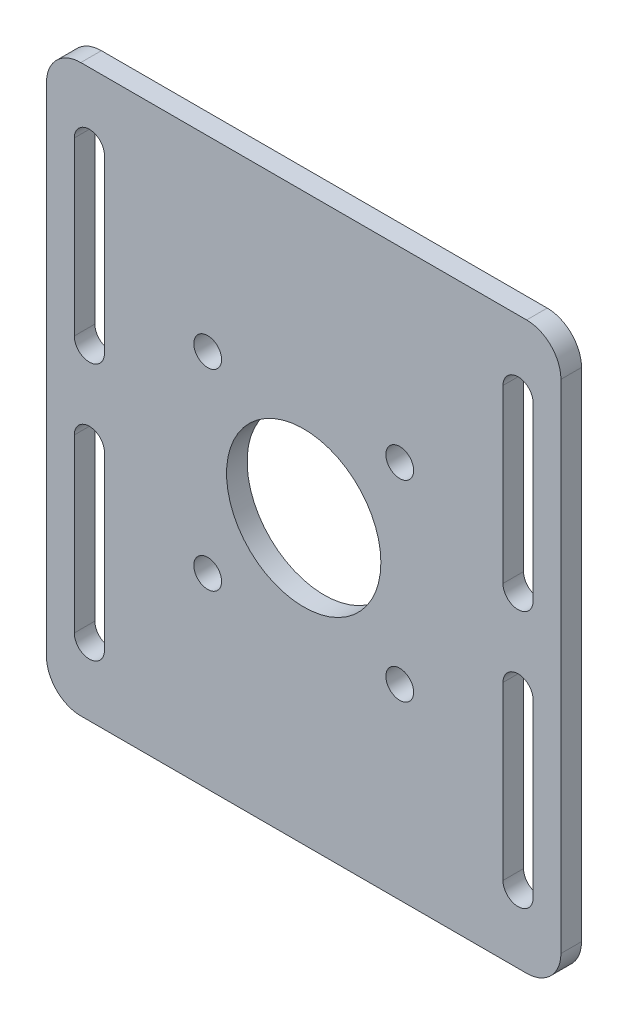
ISO-10303-21;
HEADER;
FILE_DESCRIPTION(('STEP AP214'),'2;1');
FILE_NAME('part.step','',(''),(''),'','','');
FILE_SCHEMA(('AUTOMOTIVE_DESIGN { 1 0 10303 214 1 1 1 1 }'));
ENDSEC;
DATA;
#1=APPLICATION_CONTEXT('core data for automotive mechanical design processes');
#2=APPLICATION_PROTOCOL_DEFINITION('international standard','automotive_design',2000,#1);
#3=PRODUCT_CONTEXT('',#1,'mechanical');
#4=PRODUCT('Part','Part','',(#3));
#5=PRODUCT_RELATED_PRODUCT_CATEGORY('part','',(#4));
#6=PRODUCT_DEFINITION_FORMATION('','',#4);
#7=PRODUCT_DEFINITION_CONTEXT('part definition',#1,'design');
#8=PRODUCT_DEFINITION('design','',#6,#7);
#9=PRODUCT_DEFINITION_SHAPE('','',#8);
#10=(LENGTH_UNIT() NAMED_UNIT(*) SI_UNIT(.MILLI.,.METRE.));
#11=(NAMED_UNIT(*) PLANE_ANGLE_UNIT() SI_UNIT($,.RADIAN.));
#12=(NAMED_UNIT(*) SI_UNIT($,.STERADIAN.) SOLID_ANGLE_UNIT());
#13=UNCERTAINTY_MEASURE_WITH_UNIT(LENGTH_MEASURE(1.E-05),#10,'distance_accuracy_value','');
#14=(GEOMETRIC_REPRESENTATION_CONTEXT(3) GLOBAL_UNCERTAINTY_ASSIGNED_CONTEXT((#13)) GLOBAL_UNIT_ASSIGNED_CONTEXT((#10,
#11,#12)) REPRESENTATION_CONTEXT('',''));
#15=CARTESIAN_POINT('',(0.,0.,0.));
#16=DIRECTION('',(0.,0.,1.));
#17=DIRECTION('',(1.,0.,0.));
#18=AXIS2_PLACEMENT_3D('',#15,#16,#17);
#19=CARTESIAN_POINT('',(0.,0.,6.));
#20=DIRECTION('',(0.,0.,-1.));
#21=DIRECTION('',(-1.,0.,0.));
#22=AXIS2_PLACEMENT_3D('',#19,#20,#21);
#23=PLANE('',#22);
#24=DIRECTION('',(0.,1.,0.));
#25=VECTOR('',#24,1.);
#26=CARTESIAN_POINT('',(-116.2,25.,6.00000000000001));
#27=LINE('',#26,#25);
#28=CARTESIAN_POINT('',(-116.2,25.,6.00000000000001));
#29=VERTEX_POINT('',#28);
#30=CARTESIAN_POINT('',(-116.2,125.,6.00000000000001));
#31=VERTEX_POINT('',#30);
#32=EDGE_CURVE('E295',#29,#31,#27,.T.);
#33=ORIENTED_EDGE('',*,*,#32,.F.);
#34=CARTESIAN_POINT('',(-125.,25.,6.00000000000001));
#35=DIRECTION('',(0.,0.,-1.));
#36=DIRECTION('',(-1.,0.,0.));
#37=AXIS2_PLACEMENT_3D('',#34,#35,#36);
#38=CIRCLE('',#37,8.79999999999995);
#39=CARTESIAN_POINT('',(-133.8,25.,6.00000000000001));
#40=VERTEX_POINT('',#39);
#41=EDGE_CURVE('E299',#40,#29,#38,.F.);
#42=ORIENTED_EDGE('',*,*,#41,.F.);
#43=DIRECTION('',(0.,-1.,0.));
#44=VECTOR('',#43,1.);
#45=CARTESIAN_POINT('',(-133.8,25.,6.00000000000001));
#46=LINE('',#45,#44);
#47=CARTESIAN_POINT('',(-133.8,125.,6.));
#48=VERTEX_POINT('',#47);
#49=EDGE_CURVE('E268',#48,#40,#46,.T.);
#50=ORIENTED_EDGE('',*,*,#49,.F.);
#51=CARTESIAN_POINT('',(-125.,125.,6.00000000000001));
#52=DIRECTION('',(0.,0.,-1.));
#53=DIRECTION('',(-1.,0.,0.));
#54=AXIS2_PLACEMENT_3D('',#51,#52,#53);
#55=CIRCLE('',#54,8.79999999999994);
#56=EDGE_CURVE('E292',#31,#48,#55,.F.);
#57=ORIENTED_EDGE('',*,*,#56,.F.);
#58=EDGE_LOOP('',(#33,#42,#50,#57));
#59=FACE_BOUND('',#58,.T.);
#60=DIRECTION('',(0.,-1.,0.));
#61=VECTOR('',#60,1.);
#62=CARTESIAN_POINT('',(-133.8,-25.,6.00000000000001));
#63=LINE('',#62,#61);
#64=CARTESIAN_POINT('',(-133.8,-25.,6.00000000000001));
#65=VERTEX_POINT('',#64);
#66=CARTESIAN_POINT('',(-133.8,-125.,6.00000000000001));
#67=VERTEX_POINT('',#66);
#68=EDGE_CURVE('E256',#65,#67,#63,.T.);
#69=ORIENTED_EDGE('',*,*,#68,.F.);
#70=CARTESIAN_POINT('',(-125.,-25.,6.00000000000001));
#71=DIRECTION('',(0.,0.,-1.));
#72=DIRECTION('',(-1.,0.,0.));
#73=AXIS2_PLACEMENT_3D('',#70,#71,#72);
#74=CIRCLE('',#73,8.79999999999995);
#75=CARTESIAN_POINT('',(-116.2,-25.,6.00000000000001));
#76=VERTEX_POINT('',#75);
#77=EDGE_CURVE('E260',#76,#65,#74,.F.);
#78=ORIENTED_EDGE('',*,*,#77,.F.);
#79=DIRECTION('',(0.,1.,0.));
#80=VECTOR('',#79,1.);
#81=CARTESIAN_POINT('',(-116.2,-25.,6.00000000000001));
#82=LINE('',#81,#80);
#83=CARTESIAN_POINT('',(-116.2,-125.,6.));
#84=VERTEX_POINT('',#83);
#85=EDGE_CURVE('E263',#84,#76,#82,.T.);
#86=ORIENTED_EDGE('',*,*,#85,.F.);
#87=CARTESIAN_POINT('',(-125.,-125.,6.00000000000001));
#88=DIRECTION('',(0.,0.,-1.));
#89=DIRECTION('',(-1.,0.,0.));
#90=AXIS2_PLACEMENT_3D('',#87,#88,#89);
#91=CIRCLE('',#90,8.79999999999994);
#92=EDGE_CURVE('E253',#67,#84,#91,.F.);
#93=ORIENTED_EDGE('',*,*,#92,.F.);
#94=EDGE_LOOP('',(#69,#78,#86,#93));
#95=FACE_BOUND('',#94,.T.);
#96=DIRECTION('',(0.,-1.,0.));
#97=VECTOR('',#96,1.);
#98=CARTESIAN_POINT('',(116.2,-24.9999999999999,6.00000000000001));
#99=LINE('',#98,#97);
#100=CARTESIAN_POINT('',(116.2,-24.9999999999999,6.00000000000001));
#101=VERTEX_POINT('',#100);
#102=CARTESIAN_POINT('',(116.2,-125.,6.00000000000001));
#103=VERTEX_POINT('',#102);
#104=EDGE_CURVE('E835',#101,#103,#99,.T.);
#105=ORIENTED_EDGE('',*,*,#104,.F.);
#106=CARTESIAN_POINT('',(125.,-25.,6.00000000000001));
#107=DIRECTION('',(0.,0.,-1.));
#108=DIRECTION('',(-1.,0.,0.));
#109=AXIS2_PLACEMENT_3D('',#106,#107,#108);
#110=CIRCLE('',#109,8.79999999999996);
#111=CARTESIAN_POINT('',(133.8,-25.,6.00000000000001));
#112=VERTEX_POINT('',#111);
#113=EDGE_CURVE('E252',#112,#101,#110,.F.);
#114=ORIENTED_EDGE('',*,*,#113,.F.);
#115=DIRECTION('',(0.,1.,0.));
#116=VECTOR('',#115,1.);
#117=CARTESIAN_POINT('',(133.8,-25.,6.00000000000001));
#118=LINE('',#117,#116);
#119=CARTESIAN_POINT('',(133.8,-125.,6.));
#120=VERTEX_POINT('',#119);
#121=EDGE_CURVE('E248',#120,#112,#118,.T.);
#122=ORIENTED_EDGE('',*,*,#121,.F.);
#123=CARTESIAN_POINT('',(125.,-125.,6.00000000000001));
#124=DIRECTION('',(0.,0.,-1.));
#125=DIRECTION('',(-1.,0.,0.));
#126=AXIS2_PLACEMENT_3D('',#123,#124,#125);
#127=CIRCLE('',#126,8.79999999999997);
#128=EDGE_CURVE('E213',#103,#120,#127,.F.);
#129=ORIENTED_EDGE('',*,*,#128,.F.);
#130=EDGE_LOOP('',(#105,#114,#122,#129));
#131=FACE_BOUND('',#130,.T.);
#132=DIRECTION('',(0.,1.,0.));
#133=VECTOR('',#132,1.);
#134=CARTESIAN_POINT('',(133.8,25.,6.00000000000001));
#135=LINE('',#134,#133);
#136=CARTESIAN_POINT('',(133.8,25.,6.00000000000001));
#137=VERTEX_POINT('',#136);
#138=CARTESIAN_POINT('',(133.8,125.,6.00000000000001));
#139=VERTEX_POINT('',#138);
#140=EDGE_CURVE('E333',#137,#139,#135,.T.);
#141=ORIENTED_EDGE('',*,*,#140,.F.);
#142=CARTESIAN_POINT('',(125.,25.,6.00000000000001));
#143=DIRECTION('',(0.,0.,-1.));
#144=DIRECTION('',(-1.,0.,0.));
#145=AXIS2_PLACEMENT_3D('',#142,#143,#144);
#146=CIRCLE('',#145,8.79999999999996);
#147=CARTESIAN_POINT('',(116.2,24.9999999999999,6.00000000000001));
#148=VERTEX_POINT('',#147);
#149=EDGE_CURVE('E337',#148,#137,#146,.F.);
#150=ORIENTED_EDGE('',*,*,#149,.F.);
#151=DIRECTION('',(0.,-1.,0.));
#152=VECTOR('',#151,1.);
#153=CARTESIAN_POINT('',(116.2,24.9999999999999,6.00000000000001));
#154=LINE('',#153,#152);
#155=CARTESIAN_POINT('',(116.2,125.,6.));
#156=VERTEX_POINT('',#155);
#157=EDGE_CURVE('E340',#156,#148,#154,.T.);
#158=ORIENTED_EDGE('',*,*,#157,.F.);
#159=CARTESIAN_POINT('',(125.,125.,6.00000000000001));
#160=DIRECTION('',(0.,0.,-1.));
#161=DIRECTION('',(-1.,0.,0.));
#162=AXIS2_PLACEMENT_3D('',#159,#160,#161);
#163=CIRCLE('',#162,8.79999999999997);
#164=EDGE_CURVE('E329',#139,#156,#163,.F.);
#165=ORIENTED_EDGE('',*,*,#164,.F.);
#166=EDGE_LOOP('',(#141,#150,#158,#165));
#167=FACE_BOUND('',#166,.T.);
#168=CARTESIAN_POINT('',(-56.,-56.,6.));
#169=DIRECTION('',(0.,0.,1.));
#170=DIRECTION('',(1.,0.,0.));
#171=AXIS2_PLACEMENT_3D('',#168,#169,#170);
#172=CIRCLE('',#171,8.1);
#173=CARTESIAN_POINT('',(-47.9,-56.,6.));
#174=VERTEX_POINT('',#173);
#175=EDGE_CURVE('E369',#174,#174,#172,.T.);
#176=ORIENTED_EDGE('',*,*,#175,.F.);
#177=EDGE_LOOP('',(#176));
#178=FACE_BOUND('',#177,.T.);
#179=CARTESIAN_POINT('',(56.,-56.,6.));
#180=DIRECTION('',(0.,0.,1.));
#181=DIRECTION('',(1.,0.,0.));
#182=AXIS2_PLACEMENT_3D('',#179,#180,#181);
#183=CIRCLE('',#182,8.09999999999999);
#184=CARTESIAN_POINT('',(64.1,-56.,6.));
#185=VERTEX_POINT('',#184);
#186=EDGE_CURVE('E380',#185,#185,#183,.T.);
#187=ORIENTED_EDGE('',*,*,#186,.F.);
#188=EDGE_LOOP('',(#187));
#189=FACE_BOUND('',#188,.T.);
#190=CARTESIAN_POINT('',(56.,56.,6.));
#191=DIRECTION('',(0.,0.,1.));
#192=DIRECTION('',(1.,0.,0.));
#193=AXIS2_PLACEMENT_3D('',#190,#191,#192);
#194=CIRCLE('',#193,8.09999999999999);
#195=CARTESIAN_POINT('',(64.1,56.,6.));
#196=VERTEX_POINT('',#195);
#197=EDGE_CURVE('E370',#196,#196,#194,.T.);
#198=ORIENTED_EDGE('',*,*,#197,.F.);
#199=EDGE_LOOP('',(#198));
#200=FACE_BOUND('',#199,.T.);
#201=CARTESIAN_POINT('',(-56.,56.,6.));
#202=DIRECTION('',(0.,0.,1.));
#203=DIRECTION('',(1.,0.,0.));
#204=AXIS2_PLACEMENT_3D('',#201,#202,#203);
#205=CIRCLE('',#204,8.1);
#206=CARTESIAN_POINT('',(-47.9,56.,6.));
#207=VERTEX_POINT('',#206);
#208=EDGE_CURVE('E379',#207,#207,#205,.T.);
#209=ORIENTED_EDGE('',*,*,#208,.F.);
#210=EDGE_LOOP('',(#209));
#211=FACE_BOUND('',#210,.T.);
#212=DIRECTION('',(1.,0.,0.));
#213=VECTOR('',#212,1.);
#214=CARTESIAN_POINT('',(-150.,-165.,6.));
#215=LINE('',#214,#213);
#216=CARTESIAN_POINT('',(-130.,-165.,6.));
#217=VERTEX_POINT('',#216);
#218=CARTESIAN_POINT('',(130.,-165.,6.));
#219=VERTEX_POINT('',#218);
#220=EDGE_CURVE('E423',#217,#219,#215,.T.);
#221=ORIENTED_EDGE('',*,*,#220,.T.);
#222=CARTESIAN_POINT('',(130.,-145.,6.));
#223=DIRECTION('',(0.,0.,-1.));
#224=DIRECTION('',(-1.,0.,0.));
#225=AXIS2_PLACEMENT_3D('',#222,#223,#224);
#226=CIRCLE('',#225,20.);
#227=CARTESIAN_POINT('',(150.,-145.,6.));
#228=VERTEX_POINT('',#227);
#229=EDGE_CURVE('E476',#219,#228,#226,.F.);
#230=ORIENTED_EDGE('',*,*,#229,.T.);
#231=DIRECTION('',(0.,1.,0.));
#232=VECTOR('',#231,1.);
#233=CARTESIAN_POINT('',(150.,-165.,6.));
#234=LINE('',#233,#232);
#235=CARTESIAN_POINT('',(150.,145.,6.));
#236=VERTEX_POINT('',#235);
#237=EDGE_CURVE('E410',#228,#236,#234,.T.);
#238=ORIENTED_EDGE('',*,*,#237,.T.);
#239=CARTESIAN_POINT('',(130.,145.,6.));
#240=DIRECTION('',(0.,0.,-1.));
#241=DIRECTION('',(-1.,0.,0.));
#242=AXIS2_PLACEMENT_3D('',#239,#240,#241);
#243=CIRCLE('',#242,20.);
#244=CARTESIAN_POINT('',(130.,165.,6.));
#245=VERTEX_POINT('',#244);
#246=EDGE_CURVE('E470',#236,#245,#243,.F.);
#247=ORIENTED_EDGE('',*,*,#246,.T.);
#248=DIRECTION('',(-1.,0.,0.));
#249=VECTOR('',#248,1.);
#250=CARTESIAN_POINT('',(-150.,165.,6.));
#251=LINE('',#250,#249);
#252=CARTESIAN_POINT('',(-130.,165.,6.));
#253=VERTEX_POINT('',#252);
#254=EDGE_CURVE('E414',#245,#253,#251,.T.);
#255=ORIENTED_EDGE('',*,*,#254,.T.);
#256=CARTESIAN_POINT('',(-130.,145.,6.));
#257=DIRECTION('',(0.,0.,-1.));
#258=DIRECTION('',(-1.,0.,0.));
#259=AXIS2_PLACEMENT_3D('',#256,#257,#258);
#260=CIRCLE('',#259,20.);
#261=CARTESIAN_POINT('',(-150.,145.,6.));
#262=VERTEX_POINT('',#261);
#263=EDGE_CURVE('E467',#253,#262,#260,.F.);
#264=ORIENTED_EDGE('',*,*,#263,.T.);
#265=DIRECTION('',(0.,-1.,0.));
#266=VECTOR('',#265,1.);
#267=CARTESIAN_POINT('',(-150.,-165.,6.));
#268=LINE('',#267,#266);
#269=CARTESIAN_POINT('',(-150.,-145.,6.));
#270=VERTEX_POINT('',#269);
#271=EDGE_CURVE('E419',#262,#270,#268,.T.);
#272=ORIENTED_EDGE('',*,*,#271,.T.);
#273=CARTESIAN_POINT('',(-130.,-145.,6.));
#274=DIRECTION('',(0.,0.,-1.));
#275=DIRECTION('',(-1.,0.,0.));
#276=AXIS2_PLACEMENT_3D('',#273,#274,#275);
#277=CIRCLE('',#276,20.);
#278=EDGE_CURVE('E473',#270,#217,#277,.F.);
#279=ORIENTED_EDGE('',*,*,#278,.T.);
#280=EDGE_LOOP('',(#221,#230,#238,#247,#255,#264,#272,#279));
#281=FACE_BOUND('',#280,.T.);
#282=CARTESIAN_POINT('',(0.,0.,6.));
#283=DIRECTION('',(0.,0.,1.));
#284=DIRECTION('',(1.,0.,0.));
#285=AXIS2_PLACEMENT_3D('',#282,#283,#284);
#286=CIRCLE('',#285,45.);
#287=CARTESIAN_POINT('',(45.,0.,6.));
#288=VERTEX_POINT('',#287);
#289=EDGE_CURVE('E402',#288,#288,#286,.T.);
#290=ORIENTED_EDGE('',*,*,#289,.F.);
#291=EDGE_LOOP('',(#290));
#292=FACE_BOUND('',#291,.T.);
#293=ADVANCED_FACE('F43',(#59,#95,#131,#167,#178,#189,#200,#211,#281,#292),#23,.F.);
#294=CARTESIAN_POINT('',(0.,0.,-6.));
#295=DIRECTION('',(0.,0.,-1.));
#296=DIRECTION('',(-1.,0.,0.));
#297=AXIS2_PLACEMENT_3D('',#294,#295,#296);
#298=PLANE('',#297);
#299=CARTESIAN_POINT('',(-125.,25.,-6.));
#300=DIRECTION('',(0.,0.,-1.));
#301=DIRECTION('',(1.,0.,0.));
#302=AXIS2_PLACEMENT_3D('',#299,#300,#301);
#303=CIRCLE('',#302,8.79999999999995);
#304=CARTESIAN_POINT('',(-116.2,25.,-6.));
#305=VERTEX_POINT('',#304);
#306=CARTESIAN_POINT('',(-133.8,25.,-6.));
#307=VERTEX_POINT('',#306);
#308=EDGE_CURVE('E302',#305,#307,#303,.T.);
#309=ORIENTED_EDGE('',*,*,#308,.F.);
#310=DIRECTION('',(0.,-1.,0.));
#311=VECTOR('',#310,1.);
#312=CARTESIAN_POINT('',(-116.2,25.,-6.));
#313=LINE('',#312,#311);
#314=CARTESIAN_POINT('',(-116.2,125.,-6.));
#315=VERTEX_POINT('',#314);
#316=EDGE_CURVE('E312',#315,#305,#313,.T.);
#317=ORIENTED_EDGE('',*,*,#316,.F.);
#318=CARTESIAN_POINT('',(-125.,125.,-6.));
#319=DIRECTION('',(0.,0.,-1.));
#320=DIRECTION('',(1.,0.,0.));
#321=AXIS2_PLACEMENT_3D('',#318,#319,#320);
#322=CIRCLE('',#321,8.79999999999994);
#323=CARTESIAN_POINT('',(-133.8,125.,-6.));
#324=VERTEX_POINT('',#323);
#325=EDGE_CURVE('E308',#324,#315,#322,.T.);
#326=ORIENTED_EDGE('',*,*,#325,.F.);
#327=DIRECTION('',(0.,1.,0.));
#328=VECTOR('',#327,1.);
#329=CARTESIAN_POINT('',(-133.8,25.,-6.));
#330=LINE('',#329,#328);
#331=EDGE_CURVE('E305',#307,#324,#330,.T.);
#332=ORIENTED_EDGE('',*,*,#331,.F.);
#333=EDGE_LOOP('',(#309,#317,#326,#332));
#334=FACE_BOUND('',#333,.T.);
#335=CARTESIAN_POINT('',(-125.,-25.,-6.));
#336=DIRECTION('',(0.,0.,-1.));
#337=DIRECTION('',(-1.,0.,0.));
#338=AXIS2_PLACEMENT_3D('',#335,#336,#337);
#339=CIRCLE('',#338,8.79999999999995);
#340=CARTESIAN_POINT('',(-133.8,-25.,-6.));
#341=VERTEX_POINT('',#340);
#342=CARTESIAN_POINT('',(-116.2,-25.,-6.));
#343=VERTEX_POINT('',#342);
#344=EDGE_CURVE('E264',#341,#343,#339,.T.);
#345=ORIENTED_EDGE('',*,*,#344,.F.);
#346=DIRECTION('',(0.,1.,0.));
#347=VECTOR('',#346,1.);
#348=CARTESIAN_POINT('',(-133.8,-25.,-6.));
#349=LINE('',#348,#347);
#350=CARTESIAN_POINT('',(-133.8,-125.,-6.));
#351=VERTEX_POINT('',#350);
#352=EDGE_CURVE('E275',#351,#341,#349,.T.);
#353=ORIENTED_EDGE('',*,*,#352,.F.);
#354=CARTESIAN_POINT('',(-125.,-125.,-6.));
#355=DIRECTION('',(0.,0.,-1.));
#356=DIRECTION('',(-1.,0.,0.));
#357=AXIS2_PLACEMENT_3D('',#354,#355,#356);
#358=CIRCLE('',#357,8.79999999999994);
#359=CARTESIAN_POINT('',(-116.2,-125.,-6.));
#360=VERTEX_POINT('',#359);
#361=EDGE_CURVE('E271',#360,#351,#358,.T.);
#362=ORIENTED_EDGE('',*,*,#361,.F.);
#363=DIRECTION('',(0.,-1.,0.));
#364=VECTOR('',#363,1.);
#365=CARTESIAN_POINT('',(-116.2,-25.,-6.));
#366=LINE('',#365,#364);
#367=EDGE_CURVE('E267',#343,#360,#366,.T.);
#368=ORIENTED_EDGE('',*,*,#367,.F.);
#369=EDGE_LOOP('',(#345,#353,#362,#368));
#370=FACE_BOUND('',#369,.T.);
#371=CARTESIAN_POINT('',(125.,-25.,-6.));
#372=DIRECTION('',(0.,0.,-1.));
#373=DIRECTION('',(1.,0.,0.));
#374=AXIS2_PLACEMENT_3D('',#371,#372,#373);
#375=CIRCLE('',#374,8.79999999999996);
#376=CARTESIAN_POINT('',(116.2,-24.9999999999999,-6.));
#377=VERTEX_POINT('',#376);
#378=CARTESIAN_POINT('',(133.8,-25.,-6.));
#379=VERTEX_POINT('',#378);
#380=EDGE_CURVE('E228',#377,#379,#375,.T.);
#381=ORIENTED_EDGE('',*,*,#380,.F.);
#382=DIRECTION('',(0.,1.,0.));
#383=VECTOR('',#382,1.);
#384=CARTESIAN_POINT('',(116.2,-24.9999999999999,-6.));
#385=LINE('',#384,#383);
#386=CARTESIAN_POINT('',(116.2,-125.,-6.));
#387=VERTEX_POINT('',#386);
#388=EDGE_CURVE('E233',#387,#377,#385,.T.);
#389=ORIENTED_EDGE('',*,*,#388,.F.);
#390=CARTESIAN_POINT('',(125.,-125.,-6.));
#391=DIRECTION('',(0.,0.,-1.));
#392=DIRECTION('',(1.,0.,0.));
#393=AXIS2_PLACEMENT_3D('',#390,#391,#392);
#394=CIRCLE('',#393,8.79999999999997);
#395=CARTESIAN_POINT('',(133.8,-125.,-6.));
#396=VERTEX_POINT('',#395);
#397=EDGE_CURVE('E210',#396,#387,#394,.T.);
#398=ORIENTED_EDGE('',*,*,#397,.F.);
#399=DIRECTION('',(0.,-1.,0.));
#400=VECTOR('',#399,1.);
#401=CARTESIAN_POINT('',(133.8,-25.,-6.));
#402=LINE('',#401,#400);
#403=EDGE_CURVE('E222',#379,#396,#402,.T.);
#404=ORIENTED_EDGE('',*,*,#403,.F.);
#405=EDGE_LOOP('',(#381,#389,#398,#404));
#406=FACE_BOUND('',#405,.T.);
#407=CARTESIAN_POINT('',(125.,25.,-6.));
#408=DIRECTION('',(0.,0.,-1.));
#409=DIRECTION('',(-1.,0.,0.));
#410=AXIS2_PLACEMENT_3D('',#407,#408,#409);
#411=CIRCLE('',#410,8.79999999999996);
#412=CARTESIAN_POINT('',(133.8,25.,-6.));
#413=VERTEX_POINT('',#412);
#414=CARTESIAN_POINT('',(116.2,24.9999999999999,-6.));
#415=VERTEX_POINT('',#414);
#416=EDGE_CURVE('E251',#413,#415,#411,.T.);
#417=ORIENTED_EDGE('',*,*,#416,.F.);
#418=DIRECTION('',(0.,-1.,0.));
#419=VECTOR('',#418,1.);
#420=CARTESIAN_POINT('',(133.8,25.,-6.));
#421=LINE('',#420,#419);
#422=CARTESIAN_POINT('',(133.8,125.,-6.));
#423=VERTEX_POINT('',#422);
#424=EDGE_CURVE('E351',#423,#413,#421,.T.);
#425=ORIENTED_EDGE('',*,*,#424,.F.);
#426=CARTESIAN_POINT('',(125.,125.,-6.));
#427=DIRECTION('',(0.,0.,-1.));
#428=DIRECTION('',(-1.,0.,0.));
#429=AXIS2_PLACEMENT_3D('',#426,#427,#428);
#430=CIRCLE('',#429,8.79999999999997);
#431=CARTESIAN_POINT('',(116.2,125.,-6.));
#432=VERTEX_POINT('',#431);
#433=EDGE_CURVE('E347',#432,#423,#430,.T.);
#434=ORIENTED_EDGE('',*,*,#433,.F.);
#435=DIRECTION('',(0.,1.,0.));
#436=VECTOR('',#435,1.);
#437=CARTESIAN_POINT('',(116.2,24.9999999999999,-6.));
#438=LINE('',#437,#436);
#439=EDGE_CURVE('E343',#415,#432,#438,.T.);
#440=ORIENTED_EDGE('',*,*,#439,.F.);
#441=EDGE_LOOP('',(#417,#425,#434,#440));
#442=FACE_BOUND('',#441,.T.);
#443=CARTESIAN_POINT('',(-56.,-56.,-6.));
#444=DIRECTION('',(0.,0.,-1.));
#445=DIRECTION('',(-1.,0.,0.));
#446=AXIS2_PLACEMENT_3D('',#443,#444,#445);
#447=CIRCLE('',#446,8.1);
#448=CARTESIAN_POINT('',(-64.1,-56.,-6.));
#449=VERTEX_POINT('',#448);
#450=EDGE_CURVE('E384',#449,#449,#447,.F.);
#451=ORIENTED_EDGE('',*,*,#450,.T.);
#452=EDGE_LOOP('',(#451));
#453=FACE_BOUND('',#452,.T.);
#454=CARTESIAN_POINT('',(56.,-56.,-6.));
#455=DIRECTION('',(0.,0.,-1.));
#456=DIRECTION('',(-1.,0.,0.));
#457=AXIS2_PLACEMENT_3D('',#454,#455,#456);
#458=CIRCLE('',#457,8.09999999999999);
#459=CARTESIAN_POINT('',(47.9,-56.,-6.));
#460=VERTEX_POINT('',#459);
#461=EDGE_CURVE('E375',#460,#460,#458,.F.);
#462=ORIENTED_EDGE('',*,*,#461,.T.);
#463=EDGE_LOOP('',(#462));
#464=FACE_BOUND('',#463,.T.);
#465=CARTESIAN_POINT('',(56.,56.,-6.));
#466=DIRECTION('',(0.,0.,-1.));
#467=DIRECTION('',(-1.,0.,0.));
#468=AXIS2_PLACEMENT_3D('',#465,#466,#467);
#469=CIRCLE('',#468,8.09999999999999);
#470=CARTESIAN_POINT('',(47.9,56.,-6.));
#471=VERTEX_POINT('',#470);
#472=EDGE_CURVE('E374',#471,#471,#469,.F.);
#473=ORIENTED_EDGE('',*,*,#472,.T.);
#474=EDGE_LOOP('',(#473));
#475=FACE_BOUND('',#474,.T.);
#476=CARTESIAN_POINT('',(-56.,56.,-6.));
#477=DIRECTION('',(0.,0.,-1.));
#478=DIRECTION('',(-1.,0.,0.));
#479=AXIS2_PLACEMENT_3D('',#476,#477,#478);
#480=CIRCLE('',#479,8.1);
#481=CARTESIAN_POINT('',(-64.1,56.,-6.));
#482=VERTEX_POINT('',#481);
#483=EDGE_CURVE('E397',#482,#482,#480,.F.);
#484=ORIENTED_EDGE('',*,*,#483,.T.);
#485=EDGE_LOOP('',(#484));
#486=FACE_BOUND('',#485,.T.);
#487=DIRECTION('',(0.,1.,0.));
#488=VECTOR('',#487,1.);
#489=CARTESIAN_POINT('',(150.,-165.,-6.));
#490=LINE('',#489,#488);
#491=CARTESIAN_POINT('',(150.,-145.,-6.));
#492=VERTEX_POINT('',#491);
#493=CARTESIAN_POINT('',(150.,145.,-6.));
#494=VERTEX_POINT('',#493);
#495=EDGE_CURVE('E406',#492,#494,#490,.T.);
#496=ORIENTED_EDGE('',*,*,#495,.F.);
#497=CARTESIAN_POINT('',(130.,-145.,-6.));
#498=DIRECTION('',(0.,0.,-1.));
#499=DIRECTION('',(-1.,0.,0.));
#500=AXIS2_PLACEMENT_3D('',#497,#498,#499);
#501=CIRCLE('',#500,20.);
#502=CARTESIAN_POINT('',(130.,-165.,-6.));
#503=VERTEX_POINT('',#502);
#504=EDGE_CURVE('E457',#492,#503,#501,.T.);
#505=ORIENTED_EDGE('',*,*,#504,.T.);
#506=DIRECTION('',(1.,0.,0.));
#507=VECTOR('',#506,1.);
#508=CARTESIAN_POINT('',(-150.,-165.,-6.));
#509=LINE('',#508,#507);
#510=CARTESIAN_POINT('',(-130.,-165.,-6.));
#511=VERTEX_POINT('',#510);
#512=EDGE_CURVE('E415',#511,#503,#509,.T.);
#513=ORIENTED_EDGE('',*,*,#512,.F.);
#514=CARTESIAN_POINT('',(-130.,-145.,-6.));
#515=DIRECTION('',(0.,0.,-1.));
#516=DIRECTION('',(-1.,0.,0.));
#517=AXIS2_PLACEMENT_3D('',#514,#515,#516);
#518=CIRCLE('',#517,20.);
#519=CARTESIAN_POINT('',(-150.,-145.,-6.));
#520=VERTEX_POINT('',#519);
#521=EDGE_CURVE('E454',#511,#520,#518,.T.);
#522=ORIENTED_EDGE('',*,*,#521,.T.);
#523=DIRECTION('',(0.,-1.,0.));
#524=VECTOR('',#523,1.);
#525=CARTESIAN_POINT('',(-150.,-165.,-6.));
#526=LINE('',#525,#524);
#527=CARTESIAN_POINT('',(-150.,145.,-6.));
#528=VERTEX_POINT('',#527);
#529=EDGE_CURVE('E435',#528,#520,#526,.T.);
#530=ORIENTED_EDGE('',*,*,#529,.F.);
#531=CARTESIAN_POINT('',(-130.,145.,-6.));
#532=DIRECTION('',(0.,0.,-1.));
#533=DIRECTION('',(-1.,0.,0.));
#534=AXIS2_PLACEMENT_3D('',#531,#532,#533);
#535=CIRCLE('',#534,20.);
#536=CARTESIAN_POINT('',(-130.,165.,-6.));
#537=VERTEX_POINT('',#536);
#538=EDGE_CURVE('E448',#528,#537,#535,.T.);
#539=ORIENTED_EDGE('',*,*,#538,.T.);
#540=DIRECTION('',(-1.,0.,0.));
#541=VECTOR('',#540,1.);
#542=CARTESIAN_POINT('',(-150.,165.,-6.));
#543=LINE('',#542,#541);
#544=CARTESIAN_POINT('',(130.,165.,-6.));
#545=VERTEX_POINT('',#544);
#546=EDGE_CURVE('E431',#545,#537,#543,.T.);
#547=ORIENTED_EDGE('',*,*,#546,.F.);
#548=CARTESIAN_POINT('',(130.,145.,-6.));
#549=DIRECTION('',(0.,0.,-1.));
#550=DIRECTION('',(-1.,0.,0.));
#551=AXIS2_PLACEMENT_3D('',#548,#549,#550);
#552=CIRCLE('',#551,20.);
#553=EDGE_CURVE('E451',#545,#494,#552,.T.);
#554=ORIENTED_EDGE('',*,*,#553,.T.);
#555=EDGE_LOOP('',(#496,#505,#513,#522,#530,#539,#547,#554));
#556=FACE_BOUND('',#555,.T.);
#557=CARTESIAN_POINT('',(0.,0.,-6.));
#558=DIRECTION('',(0.,0.,1.));
#559=DIRECTION('',(1.,0.,0.));
#560=AXIS2_PLACEMENT_3D('',#557,#558,#559);
#561=CIRCLE('',#560,45.);
#562=CARTESIAN_POINT('',(45.,0.,-6.));
#563=VERTEX_POINT('',#562);
#564=EDGE_CURVE('E401',#563,#563,#561,.T.);
#565=ORIENTED_EDGE('',*,*,#564,.T.);
#566=EDGE_LOOP('',(#565));
#567=FACE_BOUND('',#566,.T.);
#568=ADVANCED_FACE('F230',(#334,#370,#406,#442,#453,#464,#475,#486,#556,#567),#298,.T.);
#569=CARTESIAN_POINT('',(150.,-165.,6.));
#570=DIRECTION('',(-1.,0.,0.));
#571=DIRECTION('',(0.,0.,1.));
#572=AXIS2_PLACEMENT_3D('',#569,#570,#571);
#573=PLANE('',#572);
#574=ORIENTED_EDGE('',*,*,#237,.F.);
#575=DIRECTION('',(0.,0.,-1.));
#576=VECTOR('',#575,1.);
#577=CARTESIAN_POINT('',(150.,-145.,6.));
#578=LINE('',#577,#576);
#579=EDGE_CURVE('E444',#228,#492,#578,.T.);
#580=ORIENTED_EDGE('',*,*,#579,.T.);
#581=ORIENTED_EDGE('',*,*,#495,.T.);
#582=DIRECTION('',(0.,0.,-1.));
#583=VECTOR('',#582,1.);
#584=CARTESIAN_POINT('',(150.,145.,6.));
#585=LINE('',#584,#583);
#586=EDGE_CURVE('E427',#494,#236,#585,.F.);
#587=ORIENTED_EDGE('',*,*,#586,.T.);
#588=EDGE_LOOP('',(#574,#580,#581,#587));
#589=FACE_BOUND('',#588,.T.);
#590=ADVANCED_FACE('F522',(#589),#573,.F.);
#591=CARTESIAN_POINT('',(-150.,165.,6.));
#592=DIRECTION('',(0.,-1.,0.));
#593=DIRECTION('',(0.,0.,-1.));
#594=AXIS2_PLACEMENT_3D('',#591,#592,#593);
#595=PLANE('',#594);
#596=ORIENTED_EDGE('',*,*,#254,.F.);
#597=DIRECTION('',(0.,0.,-1.));
#598=VECTOR('',#597,1.);
#599=CARTESIAN_POINT('',(130.,165.,6.));
#600=LINE('',#599,#598);
#601=EDGE_CURVE('E11',#245,#545,#600,.T.);
#602=ORIENTED_EDGE('',*,*,#601,.T.);
#603=ORIENTED_EDGE('',*,*,#546,.T.);
#604=DIRECTION('',(0.,0.,-1.));
#605=VECTOR('',#604,1.);
#606=CARTESIAN_POINT('',(-130.,165.,6.));
#607=LINE('',#606,#605);
#608=EDGE_CURVE('E52',#537,#253,#607,.F.);
#609=ORIENTED_EDGE('',*,*,#608,.T.);
#610=EDGE_LOOP('',(#596,#602,#603,#609));
#611=FACE_BOUND('',#610,.T.);
#612=ADVANCED_FACE('F490',(#611),#595,.F.);
#613=CARTESIAN_POINT('',(-150.,-165.,6.));
#614=DIRECTION('',(1.,0.,0.));
#615=DIRECTION('',(0.,0.,-1.));
#616=AXIS2_PLACEMENT_3D('',#613,#614,#615);
#617=PLANE('',#616);
#618=ORIENTED_EDGE('',*,*,#529,.T.);
#619=DIRECTION('',(0.,0.,-1.));
#620=VECTOR('',#619,1.);
#621=CARTESIAN_POINT('',(-150.,-145.,6.));
#622=LINE('',#621,#620);
#623=EDGE_CURVE('E483',#520,#270,#622,.F.);
#624=ORIENTED_EDGE('',*,*,#623,.T.);
#625=ORIENTED_EDGE('',*,*,#271,.F.);
#626=DIRECTION('',(0.,0.,-1.));
#627=VECTOR('',#626,1.);
#628=CARTESIAN_POINT('',(-150.,145.,6.));
#629=LINE('',#628,#627);
#630=EDGE_CURVE('E479',#262,#528,#629,.T.);
#631=ORIENTED_EDGE('',*,*,#630,.T.);
#632=EDGE_LOOP('',(#618,#624,#625,#631));
#633=FACE_BOUND('',#632,.T.);
#634=ADVANCED_FACE('F502',(#633),#617,.F.);
#635=CARTESIAN_POINT('',(-150.,-165.,6.));
#636=DIRECTION('',(0.,1.,0.));
#637=DIRECTION('',(0.,0.,1.));
#638=AXIS2_PLACEMENT_3D('',#635,#636,#637);
#639=PLANE('',#638);
#640=ORIENTED_EDGE('',*,*,#512,.T.);
#641=DIRECTION('',(0.,0.,-1.));
#642=VECTOR('',#641,1.);
#643=CARTESIAN_POINT('',(130.,-165.,6.));
#644=LINE('',#643,#642);
#645=EDGE_CURVE('E464',#503,#219,#644,.F.);
#646=ORIENTED_EDGE('',*,*,#645,.T.);
#647=ORIENTED_EDGE('',*,*,#220,.F.);
#648=DIRECTION('',(0.,0.,-1.));
#649=VECTOR('',#648,1.);
#650=CARTESIAN_POINT('',(-130.,-165.,6.));
#651=LINE('',#650,#649);
#652=EDGE_CURVE('E460',#217,#511,#651,.T.);
#653=ORIENTED_EDGE('',*,*,#652,.T.);
#654=EDGE_LOOP('',(#640,#646,#647,#653));
#655=FACE_BOUND('',#654,.T.);
#656=ADVANCED_FACE('F514',(#655),#639,.F.);
#657=CARTESIAN_POINT('',(0.,0.,6.));
#658=DIRECTION('',(0.,0.,-1.));
#659=DIRECTION('',(-1.,0.,0.));
#660=AXIS2_PLACEMENT_3D('',#657,#658,#659);
#661=CYLINDRICAL_SURFACE('',#660,45.);
#662=ORIENTED_EDGE('',*,*,#289,.T.);
#663=EDGE_LOOP('',(#662));
#664=FACE_BOUND('',#663,.T.);
#665=ORIENTED_EDGE('',*,*,#564,.F.);
#666=EDGE_LOOP('',(#665));
#667=FACE_BOUND('',#666,.T.);
#668=ADVANCED_FACE('F545',(#664,#667),#661,.F.);
#669=CARTESIAN_POINT('',(130.,-145.,6.));
#670=DIRECTION('',(0.,0.,-1.));
#671=DIRECTION('',(-1.,0.,0.));
#672=AXIS2_PLACEMENT_3D('',#669,#670,#671);
#673=CYLINDRICAL_SURFACE('',#672,20.);
#674=ORIENTED_EDGE('',*,*,#229,.F.);
#675=ORIENTED_EDGE('',*,*,#645,.F.);
#676=ORIENTED_EDGE('',*,*,#504,.F.);
#677=ORIENTED_EDGE('',*,*,#579,.F.);
#678=EDGE_LOOP('',(#674,#675,#676,#677));
#679=FACE_BOUND('',#678,.T.);
#680=ADVANCED_FACE('F520',(#679),#673,.T.);
#681=CARTESIAN_POINT('',(-130.,-145.,6.));
#682=DIRECTION('',(0.,0.,-1.));
#683=DIRECTION('',(-1.,0.,0.));
#684=AXIS2_PLACEMENT_3D('',#681,#682,#683);
#685=CYLINDRICAL_SURFACE('',#684,20.);
#686=ORIENTED_EDGE('',*,*,#278,.F.);
#687=ORIENTED_EDGE('',*,*,#623,.F.);
#688=ORIENTED_EDGE('',*,*,#521,.F.);
#689=ORIENTED_EDGE('',*,*,#652,.F.);
#690=EDGE_LOOP('',(#686,#687,#688,#689));
#691=FACE_BOUND('',#690,.T.);
#692=ADVANCED_FACE('F511',(#691),#685,.T.);
#693=CARTESIAN_POINT('',(130.,145.,6.));
#694=DIRECTION('',(0.,0.,-1.));
#695=DIRECTION('',(-1.,0.,0.));
#696=AXIS2_PLACEMENT_3D('',#693,#694,#695);
#697=CYLINDRICAL_SURFACE('',#696,20.);
#698=ORIENTED_EDGE('',*,*,#246,.F.);
#699=ORIENTED_EDGE('',*,*,#586,.F.);
#700=ORIENTED_EDGE('',*,*,#553,.F.);
#701=ORIENTED_EDGE('',*,*,#601,.F.);
#702=EDGE_LOOP('',(#698,#699,#700,#701));
#703=FACE_BOUND('',#702,.T.);
#704=ADVANCED_FACE('F525',(#703),#697,.T.);
#705=CARTESIAN_POINT('',(-130.,145.,6.));
#706=DIRECTION('',(0.,0.,-1.));
#707=DIRECTION('',(-1.,0.,0.));
#708=AXIS2_PLACEMENT_3D('',#705,#706,#707);
#709=CYLINDRICAL_SURFACE('',#708,20.);
#710=ORIENTED_EDGE('',*,*,#263,.F.);
#711=ORIENTED_EDGE('',*,*,#608,.F.);
#712=ORIENTED_EDGE('',*,*,#538,.F.);
#713=ORIENTED_EDGE('',*,*,#630,.F.);
#714=EDGE_LOOP('',(#710,#711,#712,#713));
#715=FACE_BOUND('',#714,.T.);
#716=ADVANCED_FACE('F45',(#715),#709,.T.);
#717=CARTESIAN_POINT('',(-56.,56.,-28.9102597104441));
#718=DIRECTION('',(0.,0.,1.));
#719=DIRECTION('',(1.,0.,0.));
#720=AXIS2_PLACEMENT_3D('',#717,#718,#719);
#721=CYLINDRICAL_SURFACE('',#720,8.1);
#722=ORIENTED_EDGE('',*,*,#208,.T.);
#723=EDGE_LOOP('',(#722));
#724=FACE_BOUND('',#723,.T.);
#725=ORIENTED_EDGE('',*,*,#483,.F.);
#726=EDGE_LOOP('',(#725));
#727=FACE_BOUND('',#726,.T.);
#728=ADVANCED_FACE('F531',(#724,#727),#721,.F.);
#729=CARTESIAN_POINT('',(56.,56.,-28.9102597104441));
#730=DIRECTION('',(0.,0.,1.));
#731=DIRECTION('',(1.,0.,0.));
#732=AXIS2_PLACEMENT_3D('',#729,#730,#731);
#733=CYLINDRICAL_SURFACE('',#732,8.09999999999999);
#734=ORIENTED_EDGE('',*,*,#197,.T.);
#735=EDGE_LOOP('',(#734));
#736=FACE_BOUND('',#735,.T.);
#737=ORIENTED_EDGE('',*,*,#472,.F.);
#738=EDGE_LOOP('',(#737));
#739=FACE_BOUND('',#738,.T.);
#740=ADVANCED_FACE('F616',(#736,#739),#733,.F.);
#741=CARTESIAN_POINT('',(56.,-56.,-28.9102597104441));
#742=DIRECTION('',(0.,0.,1.));
#743=DIRECTION('',(1.,0.,0.));
#744=AXIS2_PLACEMENT_3D('',#741,#742,#743);
#745=CYLINDRICAL_SURFACE('',#744,8.09999999999999);
#746=ORIENTED_EDGE('',*,*,#186,.T.);
#747=EDGE_LOOP('',(#746));
#748=FACE_BOUND('',#747,.T.);
#749=ORIENTED_EDGE('',*,*,#461,.F.);
#750=EDGE_LOOP('',(#749));
#751=FACE_BOUND('',#750,.T.);
#752=ADVANCED_FACE('F624',(#748,#751),#745,.F.);
#753=CARTESIAN_POINT('',(-56.,-56.,-28.9102597104441));
#754=DIRECTION('',(0.,0.,1.));
#755=DIRECTION('',(1.,0.,0.));
#756=AXIS2_PLACEMENT_3D('',#753,#754,#755);
#757=CYLINDRICAL_SURFACE('',#756,8.1);
#758=ORIENTED_EDGE('',*,*,#175,.T.);
#759=EDGE_LOOP('',(#758));
#760=FACE_BOUND('',#759,.T.);
#761=ORIENTED_EDGE('',*,*,#450,.F.);
#762=EDGE_LOOP('',(#761));
#763=FACE_BOUND('',#762,.T.);
#764=ADVANCED_FACE('F633',(#760,#763),#757,.F.);
#765=CARTESIAN_POINT('',(125.,25.,124.909713648633));
#766=DIRECTION('',(0.,0.,-1.));
#767=DIRECTION('',(-1.,0.,0.));
#768=AXIS2_PLACEMENT_3D('',#765,#766,#767);
#769=CYLINDRICAL_SURFACE('',#768,8.79999999999996);
#770=ORIENTED_EDGE('',*,*,#149,.T.);
#771=DIRECTION('',(0.,0.,-1.));
#772=VECTOR('',#771,1.);
#773=CARTESIAN_POINT('',(133.8,25.,124.909713648633));
#774=LINE('',#773,#772);
#775=EDGE_CURVE('E334',#137,#413,#774,.T.);
#776=ORIENTED_EDGE('',*,*,#775,.T.);
#777=ORIENTED_EDGE('',*,*,#416,.T.);
#778=DIRECTION('',(0.,0.,-1.));
#779=VECTOR('',#778,1.);
#780=CARTESIAN_POINT('',(116.2,24.9999999999999,124.909713648633));
#781=LINE('',#780,#779);
#782=EDGE_CURVE('E355',#148,#415,#781,.T.);
#783=ORIENTED_EDGE('',*,*,#782,.F.);
#784=EDGE_LOOP('',(#770,#776,#777,#783));
#785=FACE_BOUND('',#784,.T.);
#786=ADVANCED_FACE('F641',(#785),#769,.F.);
#787=CARTESIAN_POINT('',(133.8,25.,124.909713648633));
#788=DIRECTION('',(1.,0.,0.));
#789=DIRECTION('',(0.,1.,0.));
#790=AXIS2_PLACEMENT_3D('',#787,#788,#789);
#791=PLANE('',#790);
#792=ORIENTED_EDGE('',*,*,#140,.T.);
#793=DIRECTION('',(0.,0.,-1.));
#794=VECTOR('',#793,1.);
#795=CARTESIAN_POINT('',(133.8,125.,124.909713648633));
#796=LINE('',#795,#794);
#797=EDGE_CURVE('E358',#139,#423,#796,.T.);
#798=ORIENTED_EDGE('',*,*,#797,.T.);
#799=ORIENTED_EDGE('',*,*,#424,.T.);
#800=ORIENTED_EDGE('',*,*,#775,.F.);
#801=EDGE_LOOP('',(#792,#798,#799,#800));
#802=FACE_BOUND('',#801,.T.);
#803=ADVANCED_FACE('F650',(#802),#791,.F.);
#804=CARTESIAN_POINT('',(125.,125.,124.909713648633));
#805=DIRECTION('',(0.,0.,-1.));
#806=DIRECTION('',(-1.,0.,0.));
#807=AXIS2_PLACEMENT_3D('',#804,#805,#806);
#808=CYLINDRICAL_SURFACE('',#807,8.79999999999997);
#809=ORIENTED_EDGE('',*,*,#164,.T.);
#810=DIRECTION('',(0.,0.,-1.));
#811=VECTOR('',#810,1.);
#812=CARTESIAN_POINT('',(116.2,125.,124.909713648633));
#813=LINE('',#812,#811);
#814=EDGE_CURVE('E361',#156,#432,#813,.T.);
#815=ORIENTED_EDGE('',*,*,#814,.T.);
#816=ORIENTED_EDGE('',*,*,#433,.T.);
#817=ORIENTED_EDGE('',*,*,#797,.F.);
#818=EDGE_LOOP('',(#809,#815,#816,#817));
#819=FACE_BOUND('',#818,.T.);
#820=ADVANCED_FACE('F659',(#819),#808,.F.);
#821=CARTESIAN_POINT('',(116.2,24.9999999999999,124.909713648633));
#822=DIRECTION('',(-1.,0.,0.));
#823=DIRECTION('',(0.,-1.,0.));
#824=AXIS2_PLACEMENT_3D('',#821,#822,#823);
#825=PLANE('',#824);
#826=ORIENTED_EDGE('',*,*,#157,.T.);
#827=ORIENTED_EDGE('',*,*,#782,.T.);
#828=ORIENTED_EDGE('',*,*,#439,.T.);
#829=ORIENTED_EDGE('',*,*,#814,.F.);
#830=EDGE_LOOP('',(#826,#827,#828,#829));
#831=FACE_BOUND('',#830,.T.);
#832=ADVANCED_FACE('F668',(#831),#825,.F.);
#833=CARTESIAN_POINT('',(125.,-25.,124.909713648633));
#834=DIRECTION('',(0.,0.,-1.));
#835=DIRECTION('',(-1.,0.,0.));
#836=AXIS2_PLACEMENT_3D('',#833,#834,#835);
#837=CYLINDRICAL_SURFACE('',#836,8.79999999999996);
#838=ORIENTED_EDGE('',*,*,#113,.T.);
#839=DIRECTION('',(0.,0.,-1.));
#840=VECTOR('',#839,1.);
#841=CARTESIAN_POINT('',(116.2,-24.9999999999999,124.909713648633));
#842=LINE('',#841,#840);
#843=EDGE_CURVE('E241',#101,#377,#842,.T.);
#844=ORIENTED_EDGE('',*,*,#843,.T.);
#845=ORIENTED_EDGE('',*,*,#380,.T.);
#846=DIRECTION('',(0.,0.,-1.));
#847=VECTOR('',#846,1.);
#848=CARTESIAN_POINT('',(133.8,-25.,124.909713648633));
#849=LINE('',#848,#847);
#850=EDGE_CURVE('E218',#112,#379,#849,.T.);
#851=ORIENTED_EDGE('',*,*,#850,.F.);
#852=EDGE_LOOP('',(#838,#844,#845,#851));
#853=FACE_BOUND('',#852,.T.);
#854=ADVANCED_FACE('F677',(#853),#837,.F.);
#855=CARTESIAN_POINT('',(116.2,-24.9999999999999,124.909713648633));
#856=DIRECTION('',(-1.,0.,0.));
#857=DIRECTION('',(0.,-1.,0.));
#858=AXIS2_PLACEMENT_3D('',#855,#856,#857);
#859=PLANE('',#858);
#860=ORIENTED_EDGE('',*,*,#104,.T.);
#861=DIRECTION('',(0.,0.,-1.));
#862=VECTOR('',#861,1.);
#863=CARTESIAN_POINT('',(116.2,-125.,124.909713648633));
#864=LINE('',#863,#862);
#865=EDGE_CURVE('E217',#103,#387,#864,.T.);
#866=ORIENTED_EDGE('',*,*,#865,.T.);
#867=ORIENTED_EDGE('',*,*,#388,.T.);
#868=ORIENTED_EDGE('',*,*,#843,.F.);
#869=EDGE_LOOP('',(#860,#866,#867,#868));
#870=FACE_BOUND('',#869,.T.);
#871=ADVANCED_FACE('F686',(#870),#859,.F.);
#872=CARTESIAN_POINT('',(125.,-125.,124.909713648633));
#873=DIRECTION('',(0.,0.,-1.));
#874=DIRECTION('',(-1.,0.,0.));
#875=AXIS2_PLACEMENT_3D('',#872,#873,#874);
#876=CYLINDRICAL_SURFACE('',#875,8.79999999999997);
#877=ORIENTED_EDGE('',*,*,#128,.T.);
#878=DIRECTION('',(0.,0.,-1.));
#879=VECTOR('',#878,1.);
#880=CARTESIAN_POINT('',(133.8,-125.,124.909713648633));
#881=LINE('',#880,#879);
#882=EDGE_CURVE('E205',#120,#396,#881,.T.);
#883=ORIENTED_EDGE('',*,*,#882,.T.);
#884=ORIENTED_EDGE('',*,*,#397,.T.);
#885=ORIENTED_EDGE('',*,*,#865,.F.);
#886=EDGE_LOOP('',(#877,#883,#884,#885));
#887=FACE_BOUND('',#886,.T.);
#888=ADVANCED_FACE('F207',(#887),#876,.F.);
#889=CARTESIAN_POINT('',(133.8,-25.,124.909713648633));
#890=DIRECTION('',(1.,0.,0.));
#891=DIRECTION('',(0.,1.,0.));
#892=AXIS2_PLACEMENT_3D('',#889,#890,#891);
#893=PLANE('',#892);
#894=ORIENTED_EDGE('',*,*,#121,.T.);
#895=ORIENTED_EDGE('',*,*,#850,.T.);
#896=ORIENTED_EDGE('',*,*,#403,.T.);
#897=ORIENTED_EDGE('',*,*,#882,.F.);
#898=EDGE_LOOP('',(#894,#895,#896,#897));
#899=FACE_BOUND('',#898,.T.);
#900=ADVANCED_FACE('F223',(#899),#893,.F.);
#901=CARTESIAN_POINT('',(-125.,-25.,124.909713648633));
#902=DIRECTION('',(0.,0.,-1.));
#903=DIRECTION('',(-1.,0.,0.));
#904=AXIS2_PLACEMENT_3D('',#901,#902,#903);
#905=CYLINDRICAL_SURFACE('',#904,8.79999999999995);
#906=ORIENTED_EDGE('',*,*,#77,.T.);
#907=DIRECTION('',(0.,0.,-1.));
#908=VECTOR('',#907,1.);
#909=CARTESIAN_POINT('',(-133.8,-25.,124.909713648633));
#910=LINE('',#909,#908);
#911=EDGE_CURVE('E257',#65,#341,#910,.T.);
#912=ORIENTED_EDGE('',*,*,#911,.T.);
#913=ORIENTED_EDGE('',*,*,#344,.T.);
#914=DIRECTION('',(0.,0.,-1.));
#915=VECTOR('',#914,1.);
#916=CARTESIAN_POINT('',(-116.2,-25.,124.909713648633));
#917=LINE('',#916,#915);
#918=EDGE_CURVE('E279',#76,#343,#917,.T.);
#919=ORIENTED_EDGE('',*,*,#918,.F.);
#920=EDGE_LOOP('',(#906,#912,#913,#919));
#921=FACE_BOUND('',#920,.T.);
#922=ADVANCED_FACE('F710',(#921),#905,.F.);
#923=CARTESIAN_POINT('',(-133.8,-25.,124.909713648633));
#924=DIRECTION('',(-1.,0.,0.));
#925=DIRECTION('',(0.,-1.,0.));
#926=AXIS2_PLACEMENT_3D('',#923,#924,#925);
#927=PLANE('',#926);
#928=ORIENTED_EDGE('',*,*,#68,.T.);
#929=DIRECTION('',(0.,0.,-1.));
#930=VECTOR('',#929,1.);
#931=CARTESIAN_POINT('',(-133.8,-125.,124.909713648633));
#932=LINE('',#931,#930);
#933=EDGE_CURVE('E282',#67,#351,#932,.T.);
#934=ORIENTED_EDGE('',*,*,#933,.T.);
#935=ORIENTED_EDGE('',*,*,#352,.T.);
#936=ORIENTED_EDGE('',*,*,#911,.F.);
#937=EDGE_LOOP('',(#928,#934,#935,#936));
#938=FACE_BOUND('',#937,.T.);
#939=ADVANCED_FACE('F718',(#938),#927,.F.);
#940=CARTESIAN_POINT('',(-125.,-125.,124.909713648633));
#941=DIRECTION('',(0.,0.,-1.));
#942=DIRECTION('',(-1.,0.,0.));
#943=AXIS2_PLACEMENT_3D('',#940,#941,#942);
#944=CYLINDRICAL_SURFACE('',#943,8.79999999999994);
#945=ORIENTED_EDGE('',*,*,#92,.T.);
#946=DIRECTION('',(0.,0.,-1.));
#947=VECTOR('',#946,1.);
#948=CARTESIAN_POINT('',(-116.2,-125.,124.909713648633));
#949=LINE('',#948,#947);
#950=EDGE_CURVE('E67',#84,#360,#949,.T.);
#951=ORIENTED_EDGE('',*,*,#950,.T.);
#952=ORIENTED_EDGE('',*,*,#361,.T.);
#953=ORIENTED_EDGE('',*,*,#933,.F.);
#954=EDGE_LOOP('',(#945,#951,#952,#953));
#955=FACE_BOUND('',#954,.T.);
#956=ADVANCED_FACE('F727',(#955),#944,.F.);
#957=CARTESIAN_POINT('',(-116.2,-25.,124.909713648633));
#958=DIRECTION('',(1.,0.,0.));
#959=DIRECTION('',(0.,1.,0.));
#960=AXIS2_PLACEMENT_3D('',#957,#958,#959);
#961=PLANE('',#960);
#962=ORIENTED_EDGE('',*,*,#85,.T.);
#963=ORIENTED_EDGE('',*,*,#918,.T.);
#964=ORIENTED_EDGE('',*,*,#367,.T.);
#965=ORIENTED_EDGE('',*,*,#950,.F.);
#966=EDGE_LOOP('',(#962,#963,#964,#965));
#967=FACE_BOUND('',#966,.T.);
#968=ADVANCED_FACE('F736',(#967),#961,.F.);
#969=CARTESIAN_POINT('',(-125.,25.,124.909713648633));
#970=DIRECTION('',(0.,0.,-1.));
#971=DIRECTION('',(-1.,0.,0.));
#972=AXIS2_PLACEMENT_3D('',#969,#970,#971);
#973=CYLINDRICAL_SURFACE('',#972,8.79999999999995);
#974=ORIENTED_EDGE('',*,*,#41,.T.);
#975=DIRECTION('',(0.,0.,-1.));
#976=VECTOR('',#975,1.);
#977=CARTESIAN_POINT('',(-116.2,25.,124.909713648633));
#978=LINE('',#977,#976);
#979=EDGE_CURVE('E296',#29,#305,#978,.T.);
#980=ORIENTED_EDGE('',*,*,#979,.T.);
#981=ORIENTED_EDGE('',*,*,#308,.T.);
#982=DIRECTION('',(0.,0.,-1.));
#983=VECTOR('',#982,1.);
#984=CARTESIAN_POINT('',(-133.8,25.,124.909713648633));
#985=LINE('',#984,#983);
#986=EDGE_CURVE('E316',#40,#307,#985,.T.);
#987=ORIENTED_EDGE('',*,*,#986,.F.);
#988=EDGE_LOOP('',(#974,#980,#981,#987));
#989=FACE_BOUND('',#988,.T.);
#990=ADVANCED_FACE('F745',(#989),#973,.F.);
#991=CARTESIAN_POINT('',(-116.2,25.,124.909713648633));
#992=DIRECTION('',(1.,0.,0.));
#993=DIRECTION('',(0.,1.,0.));
#994=AXIS2_PLACEMENT_3D('',#991,#992,#993);
#995=PLANE('',#994);
#996=ORIENTED_EDGE('',*,*,#32,.T.);
#997=DIRECTION('',(0.,0.,-1.));
#998=VECTOR('',#997,1.);
#999=CARTESIAN_POINT('',(-116.2,125.,124.909713648633));
#1000=LINE('',#999,#998);
#1001=EDGE_CURVE('E319',#31,#315,#1000,.T.);
#1002=ORIENTED_EDGE('',*,*,#1001,.T.);
#1003=ORIENTED_EDGE('',*,*,#316,.T.);
#1004=ORIENTED_EDGE('',*,*,#979,.F.);
#1005=EDGE_LOOP('',(#996,#1002,#1003,#1004));
#1006=FACE_BOUND('',#1005,.T.);
#1007=ADVANCED_FACE('F753',(#1006),#995,.F.);
#1008=CARTESIAN_POINT('',(-125.,125.,124.909713648633));
#1009=DIRECTION('',(0.,0.,-1.));
#1010=DIRECTION('',(-1.,0.,0.));
#1011=AXIS2_PLACEMENT_3D('',#1008,#1009,#1010);
#1012=CYLINDRICAL_SURFACE('',#1011,8.79999999999994);
#1013=ORIENTED_EDGE('',*,*,#56,.T.);
#1014=DIRECTION('',(0.,0.,-1.));
#1015=VECTOR('',#1014,1.);
#1016=CARTESIAN_POINT('',(-133.8,125.,124.909713648633));
#1017=LINE('',#1016,#1015);
#1018=EDGE_CURVE('E59',#48,#324,#1017,.T.);
#1019=ORIENTED_EDGE('',*,*,#1018,.T.);
#1020=ORIENTED_EDGE('',*,*,#325,.T.);
#1021=ORIENTED_EDGE('',*,*,#1001,.F.);
#1022=EDGE_LOOP('',(#1013,#1019,#1020,#1021));
#1023=FACE_BOUND('',#1022,.T.);
#1024=ADVANCED_FACE('F762',(#1023),#1012,.F.);
#1025=CARTESIAN_POINT('',(-133.8,25.,124.909713648633));
#1026=DIRECTION('',(-1.,0.,0.));
#1027=DIRECTION('',(0.,-1.,0.));
#1028=AXIS2_PLACEMENT_3D('',#1025,#1026,#1027);
#1029=PLANE('',#1028);
#1030=ORIENTED_EDGE('',*,*,#49,.T.);
#1031=ORIENTED_EDGE('',*,*,#986,.T.);
#1032=ORIENTED_EDGE('',*,*,#331,.T.);
#1033=ORIENTED_EDGE('',*,*,#1018,.F.);
#1034=EDGE_LOOP('',(#1030,#1031,#1032,#1033));
#1035=FACE_BOUND('',#1034,.T.);
#1036=ADVANCED_FACE('F771',(#1035),#1029,.F.);
#1037=CLOSED_SHELL('',(#293,#568,#590,#612,#634,#656,#668,#680,#692,#704,#716,#728,#740,#752,
#764,#786,#803,#820,#832,#854,#871,#888,#900,#922,#939,#956,#968,#990,#1007,#1024,#1036));
#1038=MANIFOLD_SOLID_BREP('B2',#1037);
#1039=ADVANCED_BREP_SHAPE_REPRESENTATION('',(#18,#1038),#14);
#1040=SHAPE_DEFINITION_REPRESENTATION(#9,#1039);
ENDSEC;
END-ISO-10303-21;
